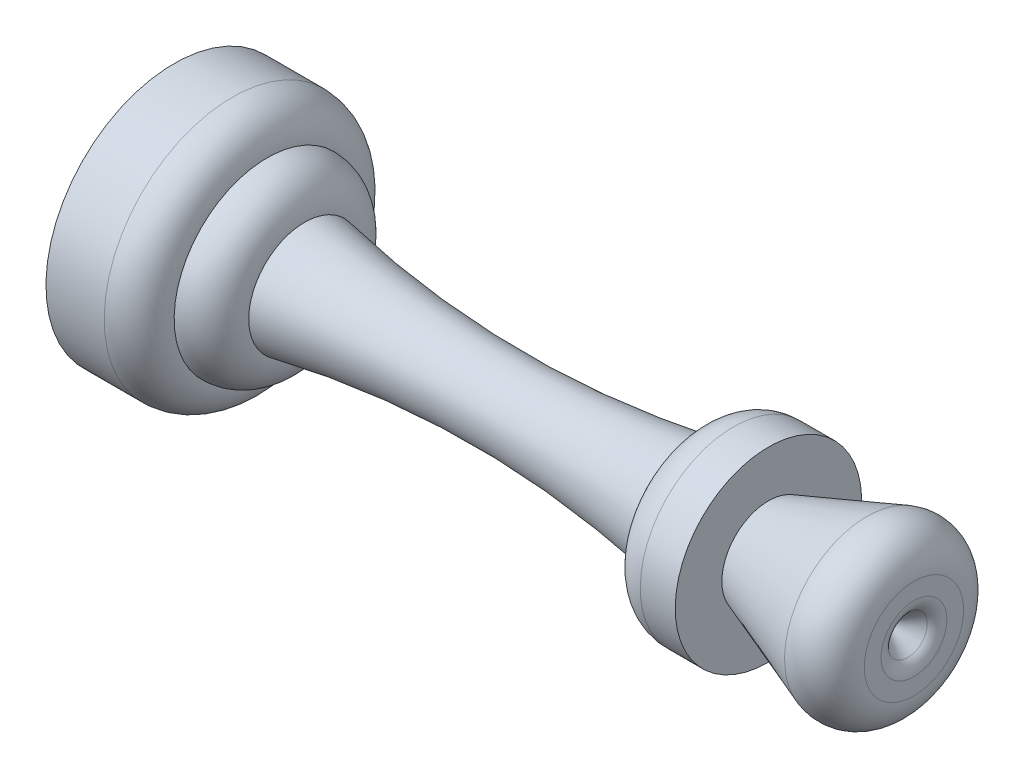
ISO-10303-21;
HEADER;
FILE_DESCRIPTION(('STEP AP214'),'2;1');
FILE_NAME('part.step','',(''),(''),'','','');
FILE_SCHEMA(('AUTOMOTIVE_DESIGN { 1 0 10303 214 1 1 1 1 }'));
ENDSEC;
DATA;
#1=APPLICATION_CONTEXT('core data for automotive mechanical design processes');
#2=APPLICATION_PROTOCOL_DEFINITION('international standard','automotive_design',2000,#1);
#3=PRODUCT_CONTEXT('',#1,'mechanical');
#4=PRODUCT('Part','Part','',(#3));
#5=PRODUCT_RELATED_PRODUCT_CATEGORY('part','',(#4));
#6=PRODUCT_DEFINITION_FORMATION('','',#4);
#7=PRODUCT_DEFINITION_CONTEXT('part definition',#1,'design');
#8=PRODUCT_DEFINITION('design','',#6,#7);
#9=PRODUCT_DEFINITION_SHAPE('','',#8);
#10=(LENGTH_UNIT() NAMED_UNIT(*) SI_UNIT(.MILLI.,.METRE.));
#11=(NAMED_UNIT(*) PLANE_ANGLE_UNIT() SI_UNIT($,.RADIAN.));
#12=(NAMED_UNIT(*) SI_UNIT($,.STERADIAN.) SOLID_ANGLE_UNIT());
#13=UNCERTAINTY_MEASURE_WITH_UNIT(LENGTH_MEASURE(1.E-05),#10,'distance_accuracy_value','');
#14=(GEOMETRIC_REPRESENTATION_CONTEXT(3) GLOBAL_UNCERTAINTY_ASSIGNED_CONTEXT((#13)) GLOBAL_UNIT_ASSIGNED_CONTEXT((#10,
#11,#12)) REPRESENTATION_CONTEXT('',''));
#15=CARTESIAN_POINT('',(0.,0.,0.));
#16=DIRECTION('',(0.,0.,1.));
#17=DIRECTION('',(1.,0.,0.));
#18=AXIS2_PLACEMENT_3D('',#15,#16,#17);
#19=CARTESIAN_POINT('',(5.,11.,0.));
#20=DIRECTION('',(-1.,0.,0.));
#21=DIRECTION('',(0.,-1.,0.));
#22=AXIS2_PLACEMENT_3D('',#19,#20,#21);
#23=TOROIDAL_SURFACE('',#22,8.,3.);
#24=CARTESIAN_POINT('',(8.,11.,0.));
#25=DIRECTION('',(-1.,0.,0.));
#26=DIRECTION('',(0.,-1.,0.));
#27=AXIS2_PLACEMENT_3D('',#24,#25,#26);
#28=CIRCLE('',#27,8.);
#29=CARTESIAN_POINT('',(8.,3.,0.));
#30=VERTEX_POINT('',#29);
#31=EDGE_CURVE('E11',#30,#30,#28,.T.);
#32=ORIENTED_EDGE('',*,*,#31,.T.);
#33=EDGE_LOOP('',(#32));
#34=FACE_BOUND('',#33,.T.);
#35=CARTESIAN_POINT('',(5.,11.,0.));
#36=DIRECTION('',(-1.,0.,0.));
#37=DIRECTION('',(0.,-1.,0.));
#38=AXIS2_PLACEMENT_3D('',#35,#36,#37);
#39=CIRCLE('',#38,11.);
#40=CARTESIAN_POINT('',(5.,0.,0.));
#41=VERTEX_POINT('',#40);
#42=EDGE_CURVE('E77',#41,#41,#39,.T.);
#43=ORIENTED_EDGE('',*,*,#42,.F.);
#44=EDGE_LOOP('',(#43));
#45=FACE_BOUND('',#44,.T.);
#46=ADVANCED_FACE('F47',(#34,#45),#23,.T.);
#47=CARTESIAN_POINT('',(8.,11.,0.));
#48=DIRECTION('',(-1.,0.,0.));
#49=DIRECTION('',(0.,-1.,0.));
#50=AXIS2_PLACEMENT_3D('',#47,#48,#49);
#51=TOROIDAL_SURFACE('',#50,4.8,3.2);
#52=CARTESIAN_POINT('',(11.2,11.,0.));
#53=DIRECTION('',(-1.,0.,0.));
#54=DIRECTION('',(0.,-1.,0.));
#55=AXIS2_PLACEMENT_3D('',#52,#53,#54);
#56=CIRCLE('',#55,4.8);
#57=CARTESIAN_POINT('',(11.2,6.2,0.));
#58=VERTEX_POINT('',#57);
#59=EDGE_CURVE('E54',#58,#58,#56,.T.);
#60=ORIENTED_EDGE('',*,*,#59,.T.);
#61=EDGE_LOOP('',(#60));
#62=FACE_BOUND('',#61,.T.);
#63=ORIENTED_EDGE('',*,*,#31,.F.);
#64=EDGE_LOOP('',(#63));
#65=FACE_BOUND('',#64,.T.);
#66=ADVANCED_FACE('F107',(#62,#65),#51,.T.);
#67=CARTESIAN_POINT('',(28.,11.,0.));
#68=DIRECTION('',(-1.,0.,0.));
#69=DIRECTION('',(0.,-1.,0.));
#70=AXIS2_PLACEMENT_3D('',#67,#68,#69);
#71=TOROIDAL_SURFACE('',#70,92.2,89.);
#72=CARTESIAN_POINT('',(44.8,11.,0.));
#73=DIRECTION('',(-1.,0.,0.));
#74=DIRECTION('',(0.,-1.,0.));
#75=AXIS2_PLACEMENT_3D('',#72,#73,#74);
#76=CIRCLE('',#75,4.8);
#77=CARTESIAN_POINT('',(44.8,6.2,0.));
#78=VERTEX_POINT('',#77);
#79=EDGE_CURVE('E100',#78,#78,#76,.T.);
#80=ORIENTED_EDGE('',*,*,#79,.T.);
#81=EDGE_LOOP('',(#80));
#82=FACE_BOUND('',#81,.T.);
#83=ORIENTED_EDGE('',*,*,#59,.F.);
#84=EDGE_LOOP('',(#83));
#85=FACE_BOUND('',#84,.T.);
#86=ADVANCED_FACE('F110',(#82,#85),#71,.F.);
#87=CARTESIAN_POINT('',(48.,11.,0.));
#88=DIRECTION('',(-1.,0.,0.));
#89=DIRECTION('',(0.,-1.,0.));
#90=AXIS2_PLACEMENT_3D('',#87,#88,#89);
#91=TOROIDAL_SURFACE('',#90,4.8,3.2);
#92=ORIENTED_EDGE('',*,*,#79,.F.);
#93=EDGE_LOOP('',(#92));
#94=FACE_BOUND('',#93,.T.);
#95=CARTESIAN_POINT('',(48.,11.,0.));
#96=DIRECTION('',(-1.,0.,0.));
#97=DIRECTION('',(0.,-1.,0.));
#98=AXIS2_PLACEMENT_3D('',#95,#96,#97);
#99=CIRCLE('',#98,8.);
#100=CARTESIAN_POINT('',(48.,3.,0.));
#101=VERTEX_POINT('',#100);
#102=EDGE_CURVE('E96',#101,#101,#99,.T.);
#103=ORIENTED_EDGE('',*,*,#102,.T.);
#104=EDGE_LOOP('',(#103));
#105=FACE_BOUND('',#104,.T.);
#106=ADVANCED_FACE('F112',(#94,#105),#91,.T.);
#107=CARTESIAN_POINT('',(0.,11.,0.));
#108=DIRECTION('',(-1.,0.,0.));
#109=DIRECTION('',(0.,-1.,0.));
#110=AXIS2_PLACEMENT_3D('',#107,#108,#109);
#111=CYLINDRICAL_SURFACE('',#110,8.);
#112=CARTESIAN_POINT('',(51.,11.,0.));
#113=DIRECTION('',(-1.,0.,0.));
#114=DIRECTION('',(0.,-1.,0.));
#115=AXIS2_PLACEMENT_3D('',#112,#113,#114);
#116=CIRCLE('',#115,8.);
#117=CARTESIAN_POINT('',(51.,3.,0.));
#118=VERTEX_POINT('',#117);
#119=EDGE_CURVE('E92',#118,#118,#116,.T.);
#120=ORIENTED_EDGE('',*,*,#119,.T.);
#121=EDGE_LOOP('',(#120));
#122=FACE_BOUND('',#121,.T.);
#123=ORIENTED_EDGE('',*,*,#102,.F.);
#124=EDGE_LOOP('',(#123));
#125=FACE_BOUND('',#124,.T.);
#126=ADVANCED_FACE('F119',(#122,#125),#111,.T.);
#127=CARTESIAN_POINT('',(51.,0.,0.));
#128=DIRECTION('',(1.,0.,0.));
#129=DIRECTION('',(0.,1.,0.));
#130=AXIS2_PLACEMENT_3D('',#127,#128,#129);
#131=PLANE('',#130);
#132=CARTESIAN_POINT('',(51.,11.,0.));
#133=DIRECTION('',(-1.,0.,0.));
#134=DIRECTION('',(0.,-1.,0.));
#135=AXIS2_PLACEMENT_3D('',#132,#133,#134);
#136=CIRCLE('',#135,4.);
#137=CARTESIAN_POINT('',(51.,7.,0.));
#138=VERTEX_POINT('',#137);
#139=EDGE_CURVE('E88',#138,#138,#136,.T.);
#140=ORIENTED_EDGE('',*,*,#139,.T.);
#141=EDGE_LOOP('',(#140));
#142=FACE_BOUND('',#141,.T.);
#143=ORIENTED_EDGE('',*,*,#119,.F.);
#144=EDGE_LOOP('',(#143));
#145=FACE_BOUND('',#144,.T.);
#146=ADVANCED_FACE('F156',(#142,#145),#131,.T.);
#147=CARTESIAN_POINT('',(51.,11.,0.));
#148=DIRECTION('',(1.,0.,0.));
#149=DIRECTION('',(0.,1.,0.));
#150=AXIS2_PLACEMENT_3D('',#147,#148,#149);
#151=CONICAL_SURFACE('',#150,4.,0.34906585039887);
#152=CARTESIAN_POINT('',(59.4572335870732,11.,0.));
#153=DIRECTION('',(-1.,0.,0.));
#154=DIRECTION('',(0.,-1.,0.));
#155=AXIS2_PLACEMENT_3D('',#152,#153,#154);
#156=CIRCLE('',#155,7.07818128993105);
#157=CARTESIAN_POINT('',(59.4572335870732,3.92181871006895,0.));
#158=VERTEX_POINT('',#157);
#159=EDGE_CURVE('E84',#158,#158,#156,.T.);
#160=ORIENTED_EDGE('',*,*,#159,.T.);
#161=EDGE_LOOP('',(#160));
#162=FACE_BOUND('',#161,.T.);
#163=ORIENTED_EDGE('',*,*,#139,.F.);
#164=EDGE_LOOP('',(#163));
#165=FACE_BOUND('',#164,.T.);
#166=ADVANCED_FACE('F152',(#162,#165),#151,.T.);
#167=CARTESIAN_POINT('',(60.4832940170502,11.,0.));
#168=DIRECTION('',(-1.,0.,0.));
#169=DIRECTION('',(0.,-1.,0.));
#170=AXIS2_PLACEMENT_3D('',#167,#168,#169);
#171=TOROIDAL_SURFACE('',#170,4.25910342757333,3.);
#172=ORIENTED_EDGE('',*,*,#159,.F.);
#173=EDGE_LOOP('',(#172));
#174=FACE_BOUND('',#173,.T.);
#175=CARTESIAN_POINT('',(63.4832940170502,11.,0.));
#176=DIRECTION('',(-1.,0.,0.));
#177=DIRECTION('',(0.,-1.,0.));
#178=AXIS2_PLACEMENT_3D('',#175,#176,#177);
#179=CIRCLE('',#178,4.25910342757333);
#180=CARTESIAN_POINT('',(63.4832940170502,6.74089657242667,0.));
#181=VERTEX_POINT('',#180);
#182=EDGE_CURVE('E74',#181,#181,#179,.T.);
#183=ORIENTED_EDGE('',*,*,#182,.T.);
#184=EDGE_LOOP('',(#183));
#185=FACE_BOUND('',#184,.T.);
#186=ADVANCED_FACE('F148',(#174,#185),#171,.T.);
#187=CARTESIAN_POINT('',(63.4832940170502,6.14434848380365E-13,0.));
#188=DIRECTION('',(1.,0.,0.));
#189=DIRECTION('',(0.,1.,0.));
#190=AXIS2_PLACEMENT_3D('',#187,#188,#189);
#191=PLANE('',#190);
#192=CARTESIAN_POINT('',(63.4832940170502,11.,0.));
#193=DIRECTION('',(-1.,0.,0.));
#194=DIRECTION('',(0.,-1.,0.));
#195=AXIS2_PLACEMENT_3D('',#192,#193,#194);
#196=CIRCLE('',#195,2.82525297779491);
#197=CARTESIAN_POINT('',(63.4832940170502,8.17474702220509,0.));
#198=VERTEX_POINT('',#197);
#199=EDGE_CURVE('E68',#198,#198,#196,.T.);
#200=ORIENTED_EDGE('',*,*,#199,.T.);
#201=EDGE_LOOP('',(#200));
#202=FACE_BOUND('',#201,.T.);
#203=ORIENTED_EDGE('',*,*,#182,.F.);
#204=EDGE_LOOP('',(#203));
#205=FACE_BOUND('',#204,.T.);
#206=ADVANCED_FACE('F145',(#202,#205),#191,.T.);
#207=CARTESIAN_POINT('',(61.9832940170502,11.,0.));
#208=DIRECTION('',(-1.,0.,0.));
#209=DIRECTION('',(0.,-1.,0.));
#210=AXIS2_PLACEMENT_3D('',#207,#208,#209);
#211=TOROIDAL_SURFACE('',#210,2.82525297779489,1.49999999999999);
#212=CARTESIAN_POINT('',(62.94747543158,11.,0.));
#213=DIRECTION('',(-1.,0.,0.));
#214=DIRECTION('',(0.,-1.,0.));
#215=AXIS2_PLACEMENT_3D('',#212,#213,#214);
#216=CIRCLE('',#215,1.67618631311644);
#217=CARTESIAN_POINT('',(62.94747543158,9.32381368688355,0.));
#218=VERTEX_POINT('',#217);
#219=EDGE_CURVE('E65',#218,#218,#216,.T.);
#220=ORIENTED_EDGE('',*,*,#219,.T.);
#221=EDGE_LOOP('',(#220));
#222=FACE_BOUND('',#221,.T.);
#223=ORIENTED_EDGE('',*,*,#199,.F.);
#224=EDGE_LOOP('',(#223));
#225=FACE_BOUND('',#224,.T.);
#226=ADVANCED_FACE('F61',(#222,#225),#211,.T.);
#227=CARTESIAN_POINT('',(62.94747543158,11.,0.));
#228=DIRECTION('',(1.,0.,0.));
#229=DIRECTION('',(0.,1.,0.));
#230=AXIS2_PLACEMENT_3D('',#227,#228,#229);
#231=CONICAL_SURFACE('',#230,1.67618631311644,0.698131700797732);
#232=CARTESIAN_POINT('',(60.9498743710662,11.,0.));
#233=VERTEX_POINT('',#232);
#234=VERTEX_LOOP('',#233);
#235=FACE_BOUND('',#234,.T.);
#236=ORIENTED_EDGE('',*,*,#219,.F.);
#237=EDGE_LOOP('',(#236));
#238=FACE_BOUND('',#237,.T.);
#239=ADVANCED_FACE('F57',(#235,#238),#231,.F.);
#240=CARTESIAN_POINT('',(0.,0.,0.));
#241=DIRECTION('',(1.,0.,0.));
#242=DIRECTION('',(0.,1.,0.));
#243=AXIS2_PLACEMENT_3D('',#240,#241,#242);
#244=PLANE('',#243);
#245=CARTESIAN_POINT('',(0.,11.,0.));
#246=DIRECTION('',(-1.,0.,0.));
#247=DIRECTION('',(0.,-1.,0.));
#248=AXIS2_PLACEMENT_3D('',#245,#246,#247);
#249=CIRCLE('',#248,11.);
#250=CARTESIAN_POINT('',(0.,0.,0.));
#251=VERTEX_POINT('',#250);
#252=EDGE_CURVE('E69',#251,#251,#249,.T.);
#253=ORIENTED_EDGE('',*,*,#252,.T.);
#254=EDGE_LOOP('',(#253));
#255=FACE_BOUND('',#254,.T.);
#256=ADVANCED_FACE('F60',(#255),#244,.F.);
#257=CARTESIAN_POINT('',(0.,11.,0.));
#258=DIRECTION('',(-1.,0.,0.));
#259=DIRECTION('',(0.,-1.,0.));
#260=AXIS2_PLACEMENT_3D('',#257,#258,#259);
#261=CYLINDRICAL_SURFACE('',#260,11.);
#262=ORIENTED_EDGE('',*,*,#42,.T.);
#263=EDGE_LOOP('',(#262));
#264=FACE_BOUND('',#263,.T.);
#265=ORIENTED_EDGE('',*,*,#252,.F.);
#266=EDGE_LOOP('',(#265));
#267=FACE_BOUND('',#266,.T.);
#268=ADVANCED_FACE('F132',(#264,#267),#261,.T.);
#269=CLOSED_SHELL('',(#46,#66,#86,#106,#126,#146,#166,#186,#206,#226,#239,#256,#268));
#270=MANIFOLD_SOLID_BREP('B2',#269);
#271=ADVANCED_BREP_SHAPE_REPRESENTATION('',(#18,#270),#14);
#272=SHAPE_DEFINITION_REPRESENTATION(#9,#271);
ENDSEC;
END-ISO-10303-21;
